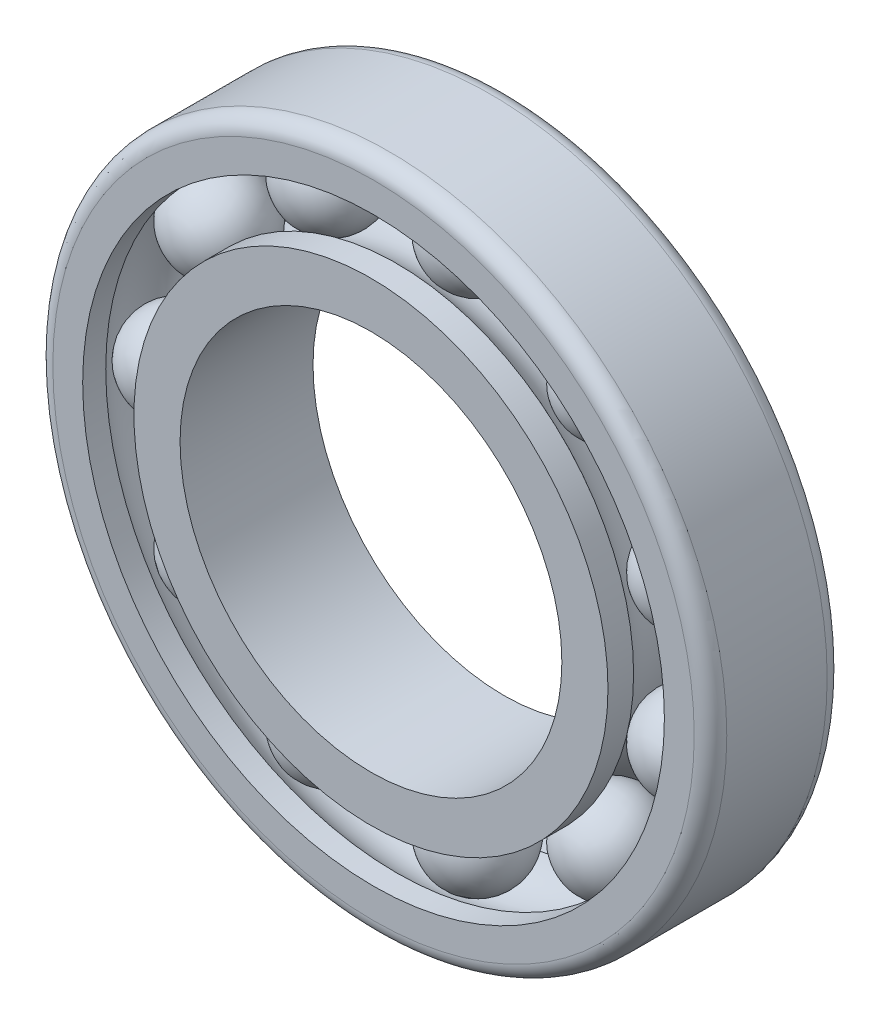
ISO-10303-21;
HEADER;
FILE_DESCRIPTION(('STEP AP214'),'2;1');
FILE_NAME('part.step','',(''),(''),'','','');
FILE_SCHEMA(('AUTOMOTIVE_DESIGN { 1 0 10303 214 1 1 1 1 }'));
ENDSEC;
DATA;
#1=APPLICATION_CONTEXT('core data for automotive mechanical design processes');
#2=APPLICATION_PROTOCOL_DEFINITION('international standard','automotive_design',2000,#1);
#3=PRODUCT_CONTEXT('',#1,'mechanical');
#4=PRODUCT('Part','Part','',(#3));
#5=PRODUCT_RELATED_PRODUCT_CATEGORY('part','',(#4));
#6=PRODUCT_DEFINITION_FORMATION('','',#4);
#7=PRODUCT_DEFINITION_CONTEXT('part definition',#1,'design');
#8=PRODUCT_DEFINITION('design','',#6,#7);
#9=PRODUCT_DEFINITION_SHAPE('','',#8);
#10=(LENGTH_UNIT() NAMED_UNIT(*) SI_UNIT(.MILLI.,.METRE.));
#11=(NAMED_UNIT(*) PLANE_ANGLE_UNIT() SI_UNIT($,.RADIAN.));
#12=(NAMED_UNIT(*) SI_UNIT($,.STERADIAN.) SOLID_ANGLE_UNIT());
#13=UNCERTAINTY_MEASURE_WITH_UNIT(LENGTH_MEASURE(1.E-05),#10,'distance_accuracy_value','');
#14=(GEOMETRIC_REPRESENTATION_CONTEXT(3) GLOBAL_UNCERTAINTY_ASSIGNED_CONTEXT((#13)) GLOBAL_UNIT_ASSIGNED_CONTEXT((#10,
#11,#12)) REPRESENTATION_CONTEXT('',''));
#15=CARTESIAN_POINT('',(0.,0.,0.));
#16=DIRECTION('',(0.,0.,1.));
#17=DIRECTION('',(1.,0.,0.));
#18=AXIS2_PLACEMENT_3D('',#15,#16,#17);
#19=CARTESIAN_POINT('',(-40.6956396507087,-26.153499544414,0.));
#20=DIRECTION('',(0.,0.,1.));
#21=DIRECTION('',(-0.841253532831189,-0.540640817455586,0.));
#22=AXIS2_PLACEMENT_3D('',#19,#20,#21);
#23=SPHERICAL_SURFACE('',#22,8.52763672995218);
#24=CARTESIAN_POINT('',(-40.6956396507087,-26.153499544414,8.52763672995215));
#25=VERTEX_POINT('',#24);
#26=VERTEX_LOOP('',#25);
#27=FACE_BOUND('',#26,.T.);
#28=ADVANCED_FACE('F40',(#27),#23,.T.);
#29=CLOSED_SHELL('',(#28));
#30=MANIFOLD_SOLID_BREP('B2',#29);
#31=CARTESIAN_POINT('',(-20.0957012539668,-44.0034477752746,0.));
#32=DIRECTION('',(0.,0.,1.));
#33=DIRECTION('',(-0.415415013001897,-0.909631995354513,0.));
#34=AXIS2_PLACEMENT_3D('',#31,#32,#33);
#35=SPHERICAL_SURFACE('',#34,8.52763672995218);
#36=CARTESIAN_POINT('',(-20.0957012539668,-44.0034477752746,8.52763672995215));
#37=VERTEX_POINT('',#36);
#38=VERTEX_LOOP('',#37);
#39=FACE_BOUND('',#38,.T.);
#40=ADVANCED_FACE('F59',(#39),#35,.T.);
#41=CLOSED_SHELL('',(#40));
#42=MANIFOLD_SOLID_BREP('B6',#41);
#43=CARTESIAN_POINT('',(6.88448030146966,-47.8826122509902,0.));
#44=DIRECTION('',(0.,0.,1.));
#45=DIRECTION('',(0.142314838273275,-0.989821441880934,0.));
#46=AXIS2_PLACEMENT_3D('',#43,#44,#45);
#47=SPHERICAL_SURFACE('',#46,8.52763672995218);
#48=CARTESIAN_POINT('',(6.88448030146966,-47.8826122509902,8.52763672995215));
#49=VERTEX_POINT('',#48);
#50=VERTEX_LOOP('',#49);
#51=FACE_BOUND('',#50,.T.);
#52=ADVANCED_FACE('F78',(#51),#47,.T.);
#53=CLOSED_SHELL('',(#52));
#54=MANIFOLD_SOLID_BREP('B36',#53);
#55=CARTESIAN_POINT('',(31.6788880046028,-36.5593856593875,0.));
#56=DIRECTION('',(0.,0.,1.));
#57=DIRECTION('',(0.654860733945278,-0.755749574354264,0.));
#58=AXIS2_PLACEMENT_3D('',#55,#56,#57);
#59=SPHERICAL_SURFACE('',#58,8.52763672995218);
#60=CARTESIAN_POINT('',(31.6788880046028,-36.5593856593875,8.52763672995215));
#61=VERTEX_POINT('',#60);
#62=VERTEX_LOOP('',#61);
#63=FACE_BOUND('',#62,.T.);
#64=ADVANCED_FACE('F97',(#63),#59,.T.);
#65=CLOSED_SHELL('',(#64));
#66=MANIFOLD_SOLID_BREP('B55',#65);
#67=CARTESIAN_POINT('',(46.4154725986012,-13.6288124372045,0.));
#68=DIRECTION('',(0.,0.,1.));
#69=DIRECTION('',(0.959492973614495,-0.281732556841437,0.));
#70=AXIS2_PLACEMENT_3D('',#67,#68,#69);
#71=SPHERICAL_SURFACE('',#70,8.52763672995218);
#72=CARTESIAN_POINT('',(46.4154725986012,-13.6288124372045,8.52763672995215));
#73=VERTEX_POINT('',#72);
#74=VERTEX_LOOP('',#73);
#75=FACE_BOUND('',#74,.T.);
#76=ADVANCED_FACE('F116',(#75),#71,.T.);
#77=CLOSED_SHELL('',(#76));
#78=MANIFOLD_SOLID_BREP('B74',#77);
#79=CARTESIAN_POINT('',(46.4154725986014,13.6288124372039,0.));
#80=DIRECTION('',(0.,0.,1.));
#81=DIRECTION('',(0.959492973614499,0.281732556841423,0.));
#82=AXIS2_PLACEMENT_3D('',#79,#80,#81);
#83=SPHERICAL_SURFACE('',#82,8.52763672995218);
#84=CARTESIAN_POINT('',(46.4154725986014,13.6288124372039,8.52763672995215));
#85=VERTEX_POINT('',#84);
#86=VERTEX_LOOP('',#85);
#87=FACE_BOUND('',#86,.T.);
#88=ADVANCED_FACE('F135',(#87),#83,.T.);
#89=CLOSED_SHELL('',(#88));
#90=MANIFOLD_SOLID_BREP('B93',#89);
#91=CARTESIAN_POINT('',(31.6788880046034,36.5593856593871,0.));
#92=DIRECTION('',(0.,0.,1.));
#93=DIRECTION('',(0.654860733945289,0.755749574354255,0.));
#94=AXIS2_PLACEMENT_3D('',#91,#92,#93);
#95=SPHERICAL_SURFACE('',#94,8.52763672995218);
#96=CARTESIAN_POINT('',(31.6788880046034,36.5593856593871,8.52763672995215));
#97=VERTEX_POINT('',#96);
#98=VERTEX_LOOP('',#97);
#99=FACE_BOUND('',#98,.T.);
#100=ADVANCED_FACE('F154',(#99),#95,.T.);
#101=CLOSED_SHELL('',(#100));
#102=MANIFOLD_SOLID_BREP('B112',#101);
#103=CARTESIAN_POINT('',(6.88448030147035,47.8826122509901,0.));
#104=DIRECTION('',(0.,0.,1.));
#105=DIRECTION('',(0.142314838273289,0.989821441880932,0.));
#106=AXIS2_PLACEMENT_3D('',#103,#104,#105);
#107=SPHERICAL_SURFACE('',#106,8.52763672995218);
#108=CARTESIAN_POINT('',(6.88448030147035,47.8826122509901,8.52763672995215));
#109=VERTEX_POINT('',#108);
#110=VERTEX_LOOP('',#109);
#111=FACE_BOUND('',#110,.T.);
#112=ADVANCED_FACE('F173',(#111),#107,.T.);
#113=CLOSED_SHELL('',(#112));
#114=MANIFOLD_SOLID_BREP('B131',#113);
#115=CARTESIAN_POINT('',(-20.0957012539661,44.0034477752749,0.));
#116=DIRECTION('',(0.,0.,1.));
#117=DIRECTION('',(-0.415415013001884,0.909631995354519,0.));
#118=AXIS2_PLACEMENT_3D('',#115,#116,#117);
#119=SPHERICAL_SURFACE('',#118,8.52763672995218);
#120=CARTESIAN_POINT('',(-20.0957012539661,44.0034477752749,8.52763672995215));
#121=VERTEX_POINT('',#120);
#122=VERTEX_LOOP('',#121);
#123=FACE_BOUND('',#122,.T.);
#124=ADVANCED_FACE('F192',(#123),#119,.T.);
#125=CLOSED_SHELL('',(#124));
#126=MANIFOLD_SOLID_BREP('B150',#125);
#127=CARTESIAN_POINT('',(-40.6956396507084,26.1534995444146,0.));
#128=DIRECTION('',(0.,0.,1.));
#129=DIRECTION('',(-0.841253532831181,0.540640817455599,0.));
#130=AXIS2_PLACEMENT_3D('',#127,#128,#129);
#131=SPHERICAL_SURFACE('',#130,8.52763672995218);
#132=CARTESIAN_POINT('',(-40.6956396507084,26.1534995444146,8.52763672995215));
#133=VERTEX_POINT('',#132);
#134=VERTEX_LOOP('',#133);
#135=FACE_BOUND('',#134,.T.);
#136=ADVANCED_FACE('F213',(#135),#131,.T.);
#137=CLOSED_SHELL('',(#136));
#138=MANIFOLD_SOLID_BREP('B169',#137);
#139=CARTESIAN_POINT('',(0.,0.,0.));
#140=DIRECTION('',(0.,0.,1.));
#141=DIRECTION('',(1.,0.,0.));
#142=AXIS2_PLACEMENT_3D('',#139,#140,#141);
#143=CYLINDRICAL_SURFACE('',#142,35.18);
#144=CARTESIAN_POINT('',(0.,0.,-11.7769581056467));
#145=DIRECTION('',(0.,0.,1.));
#146=DIRECTION('',(1.,0.,0.));
#147=AXIS2_PLACEMENT_3D('',#144,#145,#146);
#148=CIRCLE('',#147,35.18);
#149=CARTESIAN_POINT('',(35.18,0.,-11.7769581056467));
#150=VERTEX_POINT('',#149);
#151=EDGE_CURVE('E212',#150,#150,#148,.T.);
#152=ORIENTED_EDGE('',*,*,#151,.F.);
#153=EDGE_LOOP('',(#152));
#154=FACE_BOUND('',#153,.T.);
#155=CARTESIAN_POINT('',(0.,0.,12.7230418943533));
#156=DIRECTION('',(0.,0.,1.));
#157=DIRECTION('',(1.,0.,0.));
#158=AXIS2_PLACEMENT_3D('',#155,#156,#157);
#159=CIRCLE('',#158,35.18);
#160=CARTESIAN_POINT('',(35.18,0.,12.7230418943533));
#161=VERTEX_POINT('',#160);
#162=EDGE_CURVE('E256',#161,#161,#159,.T.);
#163=ORIENTED_EDGE('',*,*,#162,.T.);
#164=EDGE_LOOP('',(#163));
#165=FACE_BOUND('',#164,.T.);
#166=ADVANCED_FACE('F234',(#154,#165),#143,.F.);
#167=CARTESIAN_POINT('',(-43.68,0.,-11.7769581056467));
#168=DIRECTION('',(0.,0.,1.));
#169=DIRECTION('',(1.,0.,0.));
#170=AXIS2_PLACEMENT_3D('',#167,#168,#169);
#171=PLANE('',#170);
#172=CARTESIAN_POINT('',(0.,0.,-11.7769581056467));
#173=DIRECTION('',(0.,0.,1.));
#174=DIRECTION('',(1.,0.,0.));
#175=AXIS2_PLACEMENT_3D('',#172,#173,#174);
#176=CIRCLE('',#175,43.68);
#177=CARTESIAN_POINT('',(43.68,0.,-11.7769581056467));
#178=VERTEX_POINT('',#177);
#179=EDGE_CURVE('E240',#178,#178,#176,.T.);
#180=ORIENTED_EDGE('',*,*,#179,.F.);
#181=EDGE_LOOP('',(#180));
#182=FACE_BOUND('',#181,.T.);
#183=ORIENTED_EDGE('',*,*,#151,.T.);
#184=EDGE_LOOP('',(#183));
#185=FACE_BOUND('',#184,.T.);
#186=ADVANCED_FACE('F281',(#182,#185),#171,.F.);
#187=CARTESIAN_POINT('',(0.,0.,0.));
#188=DIRECTION('',(0.,0.,1.));
#189=DIRECTION('',(1.,0.,0.));
#190=AXIS2_PLACEMENT_3D('',#187,#188,#189);
#191=CYLINDRICAL_SURFACE('',#190,43.68);
#192=CARTESIAN_POINT('',(0.,0.,-7.52739830526625));
#193=DIRECTION('',(0.,0.,1.));
#194=DIRECTION('',(1.,0.,0.));
#195=AXIS2_PLACEMENT_3D('',#192,#193,#194);
#196=CIRCLE('',#195,43.68);
#197=CARTESIAN_POINT('',(43.68,0.,-7.52739830526625));
#198=VERTEX_POINT('',#197);
#199=EDGE_CURVE('E244',#198,#198,#196,.T.);
#200=ORIENTED_EDGE('',*,*,#199,.F.);
#201=EDGE_LOOP('',(#200));
#202=FACE_BOUND('',#201,.T.);
#203=ORIENTED_EDGE('',*,*,#179,.T.);
#204=EDGE_LOOP('',(#203));
#205=FACE_BOUND('',#204,.T.);
#206=ADVANCED_FACE('F276',(#202,#205),#191,.T.);
#207=CARTESIAN_POINT('',(0.,0.,0.236520947176657));
#208=DIRECTION('',(0.,0.,1.));
#209=DIRECTION('',(1.,0.,0.));
#210=AXIS2_PLACEMENT_3D('',#207,#208,#209);
#211=TOROIDAL_SURFACE('',#210,48.64,9.2130365330033);
#212=CARTESIAN_POINT('',(0.,0.,8.00044019961955));
#213=DIRECTION('',(0.,0.,1.));
#214=DIRECTION('',(1.,0.,0.));
#215=AXIS2_PLACEMENT_3D('',#212,#213,#214);
#216=CIRCLE('',#215,43.68);
#217=CARTESIAN_POINT('',(43.68,0.,8.00044019961955));
#218=VERTEX_POINT('',#217);
#219=EDGE_CURVE('E248',#218,#218,#216,.T.);
#220=ORIENTED_EDGE('',*,*,#219,.F.);
#221=EDGE_LOOP('',(#220));
#222=FACE_BOUND('',#221,.T.);
#223=ORIENTED_EDGE('',*,*,#199,.T.);
#224=EDGE_LOOP('',(#223));
#225=FACE_BOUND('',#224,.T.);
#226=ADVANCED_FACE('F270',(#222,#225),#211,.F.);
#227=CARTESIAN_POINT('',(0.,0.,0.));
#228=DIRECTION('',(0.,0.,1.));
#229=DIRECTION('',(1.,0.,0.));
#230=AXIS2_PLACEMENT_3D('',#227,#228,#229);
#231=CYLINDRICAL_SURFACE('',#230,43.68);
#232=CARTESIAN_POINT('',(0.,0.,12.7230418943533));
#233=DIRECTION('',(0.,0.,1.));
#234=DIRECTION('',(1.,0.,0.));
#235=AXIS2_PLACEMENT_3D('',#232,#233,#234);
#236=CIRCLE('',#235,43.68);
#237=CARTESIAN_POINT('',(43.68,0.,12.7230418943533));
#238=VERTEX_POINT('',#237);
#239=EDGE_CURVE('E253',#238,#238,#236,.T.);
#240=ORIENTED_EDGE('',*,*,#239,.F.);
#241=EDGE_LOOP('',(#240));
#242=FACE_BOUND('',#241,.T.);
#243=ORIENTED_EDGE('',*,*,#219,.T.);
#244=EDGE_LOOP('',(#243));
#245=FACE_BOUND('',#244,.T.);
#246=ADVANCED_FACE('F264',(#242,#245),#231,.T.);
#247=CARTESIAN_POINT('',(-43.68,0.,12.7230418943533));
#248=DIRECTION('',(0.,0.,-1.));
#249=DIRECTION('',(-1.,0.,0.));
#250=AXIS2_PLACEMENT_3D('',#247,#248,#249);
#251=PLANE('',#250);
#252=ORIENTED_EDGE('',*,*,#162,.F.);
#253=EDGE_LOOP('',(#252));
#254=FACE_BOUND('',#253,.T.);
#255=ORIENTED_EDGE('',*,*,#239,.T.);
#256=EDGE_LOOP('',(#255));
#257=FACE_BOUND('',#256,.T.);
#258=ADVANCED_FACE('F261',(#254,#257),#251,.F.);
#259=CLOSED_SHELL('',(#166,#186,#206,#226,#246,#258));
#260=MANIFOLD_SOLID_BREP('B188',#259);
#261=CARTESIAN_POINT('',(0.,0.,0.));
#262=DIRECTION('',(0.,0.,1.));
#263=DIRECTION('',(1.,0.,0.));
#264=AXIS2_PLACEMENT_3D('',#261,#262,#263);
#265=CYLINDRICAL_SURFACE('',#264,53.6);
#266=CARTESIAN_POINT('',(0.,0.,8.00044019961955));
#267=DIRECTION('',(0.,0.,1.));
#268=DIRECTION('',(1.,0.,0.));
#269=AXIS2_PLACEMENT_3D('',#266,#267,#268);
#270=CIRCLE('',#269,53.6);
#271=CARTESIAN_POINT('',(53.6,0.,8.00044019961955));
#272=VERTEX_POINT('',#271);
#273=EDGE_CURVE('E354',#272,#272,#270,.T.);
#274=ORIENTED_EDGE('',*,*,#273,.F.);
#275=EDGE_LOOP('',(#274));
#276=FACE_BOUND('',#275,.T.);
#277=CARTESIAN_POINT('',(0.,0.,12.25));
#278=DIRECTION('',(0.,0.,1.));
#279=DIRECTION('',(1.,0.,0.));
#280=AXIS2_PLACEMENT_3D('',#277,#278,#279);
#281=CIRCLE('',#280,53.6);
#282=CARTESIAN_POINT('',(53.6,0.,12.25));
#283=VERTEX_POINT('',#282);
#284=EDGE_CURVE('E363',#283,#283,#281,.T.);
#285=ORIENTED_EDGE('',*,*,#284,.T.);
#286=EDGE_LOOP('',(#285));
#287=FACE_BOUND('',#286,.T.);
#288=ADVANCED_FACE('F334',(#276,#287),#265,.F.);
#289=CARTESIAN_POINT('',(0.,0.,0.236520947176657));
#290=DIRECTION('',(0.,0.,1.));
#291=DIRECTION('',(1.,0.,0.));
#292=AXIS2_PLACEMENT_3D('',#289,#290,#291);
#293=TOROIDAL_SURFACE('',#292,48.64,9.2130365330033);
#294=CARTESIAN_POINT('',(0.,0.,-7.52739830526624));
#295=DIRECTION('',(0.,0.,1.));
#296=DIRECTION('',(1.,0.,0.));
#297=AXIS2_PLACEMENT_3D('',#294,#295,#296);
#298=CIRCLE('',#297,53.6);
#299=CARTESIAN_POINT('',(53.6,0.,-7.52739830526624));
#300=VERTEX_POINT('',#299);
#301=EDGE_CURVE('E357',#300,#300,#298,.T.);
#302=ORIENTED_EDGE('',*,*,#301,.F.);
#303=EDGE_LOOP('',(#302));
#304=FACE_BOUND('',#303,.T.);
#305=ORIENTED_EDGE('',*,*,#273,.T.);
#306=EDGE_LOOP('',(#305));
#307=FACE_BOUND('',#306,.T.);
#308=ADVANCED_FACE('F382',(#304,#307),#293,.F.);
#309=CARTESIAN_POINT('',(0.,0.,0.));
#310=DIRECTION('',(0.,0.,1.));
#311=DIRECTION('',(1.,0.,0.));
#312=AXIS2_PLACEMENT_3D('',#309,#310,#311);
#313=CYLINDRICAL_SURFACE('',#312,53.6);
#314=CARTESIAN_POINT('',(0.,0.,-12.25));
#315=DIRECTION('',(0.,0.,1.));
#316=DIRECTION('',(1.,0.,0.));
#317=AXIS2_PLACEMENT_3D('',#314,#315,#316);
#318=CIRCLE('',#317,53.6);
#319=CARTESIAN_POINT('',(53.6,0.,-12.25));
#320=VERTEX_POINT('',#319);
#321=EDGE_CURVE('E360',#320,#320,#318,.T.);
#322=ORIENTED_EDGE('',*,*,#321,.F.);
#323=EDGE_LOOP('',(#322));
#324=FACE_BOUND('',#323,.T.);
#325=ORIENTED_EDGE('',*,*,#301,.T.);
#326=EDGE_LOOP('',(#325));
#327=FACE_BOUND('',#326,.T.);
#328=ADVANCED_FACE('F388',(#324,#327),#313,.F.);
#329=CARTESIAN_POINT('',(-62.1,0.,-12.25));
#330=DIRECTION('',(0.,0.,1.));
#331=DIRECTION('',(1.,0.,0.));
#332=AXIS2_PLACEMENT_3D('',#329,#330,#331);
#333=PLANE('',#332);
#334=CARTESIAN_POINT('',(0.,0.,-12.25));
#335=DIRECTION('',(0.,0.,1.));
#336=DIRECTION('',(1.,0.,0.));
#337=AXIS2_PLACEMENT_3D('',#334,#335,#336);
#338=CIRCLE('',#337,59.1);
#339=CARTESIAN_POINT('',(59.1,0.,-12.25));
#340=VERTEX_POINT('',#339);
#341=EDGE_CURVE('E233',#340,#340,#338,.F.);
#342=ORIENTED_EDGE('',*,*,#341,.T.);
#343=EDGE_LOOP('',(#342));
#344=FACE_BOUND('',#343,.T.);
#345=ORIENTED_EDGE('',*,*,#321,.T.);
#346=EDGE_LOOP('',(#345));
#347=FACE_BOUND('',#346,.T.);
#348=ADVANCED_FACE('F379',(#344,#347),#333,.F.);
#349=CARTESIAN_POINT('',(0.,0.,0.));
#350=DIRECTION('',(0.,0.,1.));
#351=DIRECTION('',(1.,0.,0.));
#352=AXIS2_PLACEMENT_3D('',#349,#350,#351);
#353=CYLINDRICAL_SURFACE('',#352,62.1);
#354=CARTESIAN_POINT('',(0.,0.,9.24999999999997));
#355=DIRECTION('',(0.,0.,-1.));
#356=DIRECTION('',(-1.,0.,0.));
#357=AXIS2_PLACEMENT_3D('',#354,#355,#356);
#358=CIRCLE('',#357,62.1);
#359=CARTESIAN_POINT('',(-62.1,0.,9.24999999999997));
#360=VERTEX_POINT('',#359);
#361=EDGE_CURVE('E341',#360,#360,#358,.T.);
#362=ORIENTED_EDGE('',*,*,#361,.T.);
#363=EDGE_LOOP('',(#362));
#364=FACE_BOUND('',#363,.T.);
#365=CARTESIAN_POINT('',(0.,0.,-9.25000000000003));
#366=DIRECTION('',(0.,0.,1.));
#367=DIRECTION('',(1.,0.,0.));
#368=AXIS2_PLACEMENT_3D('',#365,#366,#367);
#369=CIRCLE('',#368,62.1);
#370=CARTESIAN_POINT('',(62.1,0.,-9.25000000000003));
#371=VERTEX_POINT('',#370);
#372=EDGE_CURVE('E345',#371,#371,#369,.T.);
#373=ORIENTED_EDGE('',*,*,#372,.T.);
#374=EDGE_LOOP('',(#373));
#375=FACE_BOUND('',#374,.T.);
#376=ADVANCED_FACE('F371',(#364,#375),#353,.T.);
#377=CARTESIAN_POINT('',(-62.1,0.,12.25));
#378=DIRECTION('',(0.,0.,-1.));
#379=DIRECTION('',(-1.,0.,0.));
#380=AXIS2_PLACEMENT_3D('',#377,#378,#379);
#381=PLANE('',#380);
#382=CARTESIAN_POINT('',(0.,0.,12.25));
#383=DIRECTION('',(0.,0.,-1.));
#384=DIRECTION('',(-1.,0.,0.));
#385=AXIS2_PLACEMENT_3D('',#382,#383,#384);
#386=CIRCLE('',#385,59.1);
#387=CARTESIAN_POINT('',(-59.1,0.,12.25));
#388=VERTEX_POINT('',#387);
#389=EDGE_CURVE('E349',#388,#388,#386,.F.);
#390=ORIENTED_EDGE('',*,*,#389,.T.);
#391=EDGE_LOOP('',(#390));
#392=FACE_BOUND('',#391,.T.);
#393=ORIENTED_EDGE('',*,*,#284,.F.);
#394=EDGE_LOOP('',(#393));
#395=FACE_BOUND('',#394,.T.);
#396=ADVANCED_FACE('F368',(#392,#395),#381,.F.);
#397=CARTESIAN_POINT('',(0.,0.,9.24999999999997));
#398=DIRECTION('',(0.,0.,-1.));
#399=DIRECTION('',(-1.,0.,0.));
#400=AXIS2_PLACEMENT_3D('',#397,#398,#399);
#401=TOROIDAL_SURFACE('',#400,59.1,3.);
#402=ORIENTED_EDGE('',*,*,#361,.F.);
#403=EDGE_LOOP('',(#402));
#404=FACE_BOUND('',#403,.T.);
#405=ORIENTED_EDGE('',*,*,#389,.F.);
#406=EDGE_LOOP('',(#405));
#407=FACE_BOUND('',#406,.T.);
#408=ADVANCED_FACE('F370',(#404,#407),#401,.T.);
#409=CARTESIAN_POINT('',(0.,0.,-9.25000000000003));
#410=DIRECTION('',(0.,0.,1.));
#411=DIRECTION('',(1.,0.,0.));
#412=AXIS2_PLACEMENT_3D('',#409,#410,#411);
#413=TOROIDAL_SURFACE('',#412,59.1,3.);
#414=ORIENTED_EDGE('',*,*,#341,.F.);
#415=EDGE_LOOP('',(#414));
#416=FACE_BOUND('',#415,.T.);
#417=ORIENTED_EDGE('',*,*,#372,.F.);
#418=EDGE_LOOP('',(#417));
#419=FACE_BOUND('',#418,.T.);
#420=ADVANCED_FACE('F336',(#416,#419),#413,.T.);
#421=CLOSED_SHELL('',(#288,#308,#328,#348,#376,#396,#408,#420));
#422=MANIFOLD_SOLID_BREP('B207',#421);
#423=CARTESIAN_POINT('',(-48.375,0.,0.));
#424=DIRECTION('',(0.,0.,1.));
#425=DIRECTION('',(-1.,0.,0.));
#426=AXIS2_PLACEMENT_3D('',#423,#424,#425);
#427=SPHERICAL_SURFACE('',#426,8.52763672995218);
#428=CARTESIAN_POINT('',(-48.375,0.,8.52763672995215));
#429=VERTEX_POINT('',#428);
#430=VERTEX_LOOP('',#429);
#431=FACE_BOUND('',#430,.T.);
#432=ADVANCED_FACE('F456',(#431),#427,.T.);
#433=CLOSED_SHELL('',(#432));
#434=MANIFOLD_SOLID_BREP('B228',#433);
#435=ADVANCED_BREP_SHAPE_REPRESENTATION('',(#18,#30,#42,#54,#66,#78,#90,#102,#114,#126,#138,
#260,#422,#434),#14);
#436=SHAPE_DEFINITION_REPRESENTATION(#9,#435);
ENDSEC;
END-ISO-10303-21;
